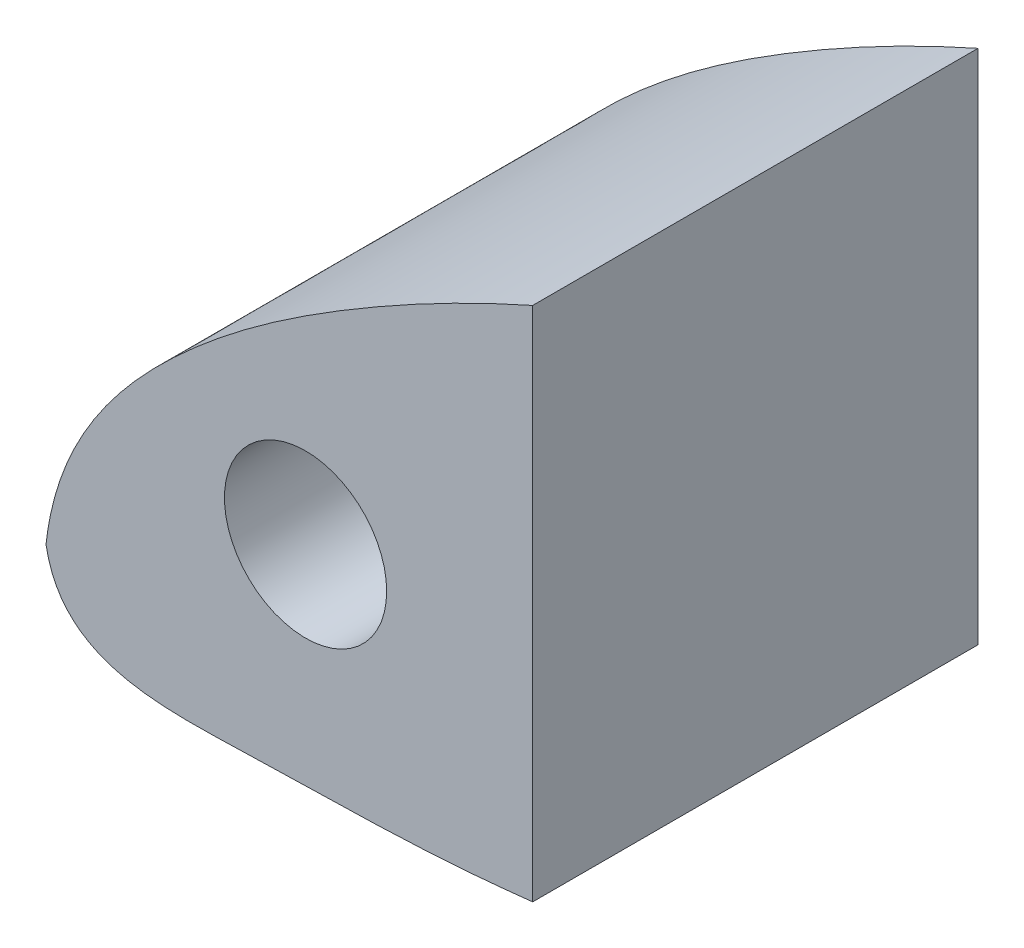
ISO-10303-21;
HEADER;
FILE_DESCRIPTION(('STEP AP214'),'2;1');
FILE_NAME('part.step','',(''),(''),'','','');
FILE_SCHEMA(('AUTOMOTIVE_DESIGN { 1 0 10303 214 1 1 1 1 }'));
ENDSEC;
DATA;
#1=APPLICATION_CONTEXT('core data for automotive mechanical design processes');
#2=APPLICATION_PROTOCOL_DEFINITION('international standard','automotive_design',2000,#1);
#3=PRODUCT_CONTEXT('',#1,'mechanical');
#4=PRODUCT('Part','Part','',(#3));
#5=PRODUCT_RELATED_PRODUCT_CATEGORY('part','',(#4));
#6=PRODUCT_DEFINITION_FORMATION('','',#4);
#7=PRODUCT_DEFINITION_CONTEXT('part definition',#1,'design');
#8=PRODUCT_DEFINITION('design','',#6,#7);
#9=PRODUCT_DEFINITION_SHAPE('','',#8);
#10=(LENGTH_UNIT() NAMED_UNIT(*) SI_UNIT(.MILLI.,.METRE.));
#11=(NAMED_UNIT(*) PLANE_ANGLE_UNIT() SI_UNIT($,.RADIAN.));
#12=(NAMED_UNIT(*) SI_UNIT($,.STERADIAN.) SOLID_ANGLE_UNIT());
#13=UNCERTAINTY_MEASURE_WITH_UNIT(LENGTH_MEASURE(1.E-05),#10,'distance_accuracy_value','');
#14=(GEOMETRIC_REPRESENTATION_CONTEXT(3) GLOBAL_UNCERTAINTY_ASSIGNED_CONTEXT((#13)) GLOBAL_UNIT_ASSIGNED_CONTEXT((#10,
#11,#12)) REPRESENTATION_CONTEXT('',''));
#15=CARTESIAN_POINT('',(0.,0.,0.));
#16=DIRECTION('',(0.,0.,1.));
#17=DIRECTION('',(1.,0.,0.));
#18=AXIS2_PLACEMENT_3D('',#15,#16,#17);
#19=CARTESIAN_POINT('',(0.000560351162113587,0.000130087070423624,34.8615));
#20=CARTESIAN_POINT('',(1.23071418869678,-6.92407609127206,34.8615));
#21=CARTESIAN_POINT('',(15.3166033306834,-6.18906584099094,34.8615));
#22=CARTESIAN_POINT('',(36.4546728163185,-6.09849990105009,34.8615));
#23=CARTESIAN_POINT('',(66.5061971849192,-0.586669106973501,34.8615));
#24=CARTESIAN_POINT('',(110.497331171581,6.18149522271792,34.8615));
#25=CARTESIAN_POINT('',(157.718638091679,9.03065014873911,34.8615));
#26=CARTESIAN_POINT('',(205.10142463584,8.83808028186313,34.8615));
#27=CARTESIAN_POINT('',(235.858814759408,7.87030619247826,34.8615));
#28=CARTESIAN_POINT('',(260.846344817159,5.42741339404395,34.8615));
#29=CARTESIAN_POINT('',(276.264022989737,4.51435670375389,34.8615));
#30=CARTESIAN_POINT('',(293.989507544058,2.09398731346533,34.8615));
#31=CARTESIAN_POINT('',(303.956832564589,1.47095520994628,34.8615));
#32=CARTESIAN_POINT('',(309.846313894505,0.000130087070423666,34.8615));
#33=B_SPLINE_CURVE_WITH_KNOTS('',3,(#19,#20,#21,#22,#23,#24,#25,#26,#27,#28,#29,#30,#31,#32),
.UNSPECIFIED.,.F.,.F.,(4,1,1,1,1,1,1,1,1,1,1,4),(0.,0.0569078595717698,0.106482711504673,
0.214488052979465,0.341297688349143,0.535095665520157,0.664680853556909,0.794660698192775,
0.828978881532905,0.904725108725214,0.942212919019968,1.),.UNSPECIFIED.);
#34=DIRECTION('',(0.,0.,-1.));
#35=VECTOR('',#34,1.);
#36=SURFACE_OF_LINEAR_EXTRUSION('',#33,#35);
#37=CARTESIAN_POINT('',(0.000560351162113587,0.000130087070423624,0.));
#38=CARTESIAN_POINT('',(1.23071418869678,-6.92407609127206,0.));
#39=CARTESIAN_POINT('',(15.3166033306834,-6.18906584099094,0.));
#40=CARTESIAN_POINT('',(36.4546728163185,-6.09849990105009,0.));
#41=CARTESIAN_POINT('',(66.5061971849192,-0.586669106973501,0.));
#42=CARTESIAN_POINT('',(110.497331171581,6.18149522271792,0.));
#43=CARTESIAN_POINT('',(157.718638091679,9.03065014873911,0.));
#44=CARTESIAN_POINT('',(205.10142463584,8.83808028186313,0.));
#45=CARTESIAN_POINT('',(235.858814759408,7.87030619247826,0.));
#46=CARTESIAN_POINT('',(260.846344817159,5.42741339404395,0.));
#47=CARTESIAN_POINT('',(276.264022989737,4.51435670375389,0.));
#48=CARTESIAN_POINT('',(293.989507544058,2.09398731346533,0.));
#49=CARTESIAN_POINT('',(303.956832564589,1.47095520994628,0.));
#50=CARTESIAN_POINT('',(309.846313894505,0.000130087070423666,0.));
#51=B_SPLINE_CURVE_WITH_KNOTS('',3,(#37,#38,#39,#40,#41,#42,#43,#44,#45,#46,#47,#48,#49,#50),
.UNSPECIFIED.,.F.,.F.,(4,1,1,1,1,1,1,1,1,1,1,4),(0.,0.0569078595717698,0.106482711504673,
0.214488052979465,0.341297688349143,0.535095665520157,0.664680853556909,0.794660698192775,
0.828978881532905,0.904725108725214,0.942212919019968,1.),.UNSPECIFIED.);
#52=CARTESIAN_POINT('',(0.000560351162116727,0.000130087070423829,0.));
#53=VERTEX_POINT('',#52);
#54=CARTESIAN_POINT('',(38.0999999979874,-5.18097252426853,0.));
#55=VERTEX_POINT('',#54);
#56=EDGE_CURVE('E100',#53,#55,#51,.T.);
#57=ORIENTED_EDGE('',*,*,#56,.T.);
#58=DIRECTION('',(0.,0.,-1.));
#59=VECTOR('',#58,1.);
#60=CARTESIAN_POINT('',(38.1,-5.18097252404465,34.8615));
#61=LINE('',#60,#59);
#62=CARTESIAN_POINT('',(38.1,-5.18097252426854,34.8615));
#63=VERTEX_POINT('',#62);
#64=EDGE_CURVE('E55',#55,#63,#61,.F.);
#65=ORIENTED_EDGE('',*,*,#64,.T.);
#66=CARTESIAN_POINT('',(0.000560351162116727,0.000130087070423829,34.8615));
#67=VERTEX_POINT('',#66);
#68=EDGE_CURVE('E84',#67,#63,#33,.T.);
#69=ORIENTED_EDGE('',*,*,#68,.F.);
#70=DIRECTION('',(0.,0.,-1.));
#71=VECTOR('',#70,1.);
#72=CARTESIAN_POINT('',(0.000560351162116727,0.000130087070423829,34.8615));
#73=LINE('',#72,#71);
#74=EDGE_CURVE('E11',#67,#53,#73,.T.);
#75=ORIENTED_EDGE('',*,*,#74,.T.);
#76=EDGE_LOOP('',(#57,#65,#69,#75));
#77=FACE_BOUND('',#76,.T.);
#78=ADVANCED_FACE('F39',(#77),#36,.F.);
#79=CARTESIAN_POINT('',(309.846313894505,0.000130087070423864,34.8615));
#80=CARTESIAN_POINT('',(314.816918223261,-0.51620674157964,34.8615));
#81=CARTESIAN_POINT('',(301.273197720551,4.38282813873556,34.8615));
#82=CARTESIAN_POINT('',(290.359837670022,8.71099439045776,34.8615));
#83=CARTESIAN_POINT('',(256.952064400645,19.5289209482833,34.8615));
#84=CARTESIAN_POINT('',(217.961060472083,29.6129748944238,34.8615));
#85=CARTESIAN_POINT('',(173.256699242147,40.0411042779434,34.8615));
#86=CARTESIAN_POINT('',(131.400792108858,47.8848319151037,34.8615));
#87=CARTESIAN_POINT('',(89.5976184754884,49.290763053775,34.8615));
#88=CARTESIAN_POINT('',(52.1111282710831,42.0692152748914,34.8615));
#89=CARTESIAN_POINT('',(26.2867198183782,29.9751763284633,34.8615));
#90=CARTESIAN_POINT('',(8.64909202481883,17.8566051741579,34.8615));
#91=CARTESIAN_POINT('',(0.810633126632263,7.35919605469637,34.8615));
#92=CARTESIAN_POINT('',(0.000560351162116727,0.000130087070423829,34.8615));
#93=B_SPLINE_CURVE_WITH_KNOTS('',3,(#79,#80,#81,#82,#83,#84,#85,#86,#87,#88,#89,#90,#91,#92),
.UNSPECIFIED.,.F.,.F.,(4,1,1,1,1,1,1,1,1,1,1,4),(0.,0.0239417713693992,0.070244030177139,
0.147561721425381,0.308455887006792,0.442387865106874,0.551517565626309,0.687091076796298,
0.811391258419108,0.886311735305172,0.939136382225768,1.),.UNSPECIFIED.);
#94=DIRECTION('',(0.,0.,-1.));
#95=VECTOR('',#94,1.);
#96=SURFACE_OF_LINEAR_EXTRUSION('',#93,#95);
#97=CARTESIAN_POINT('',(38.1,35.2581330206231,34.8615));
#98=VERTEX_POINT('',#97);
#99=EDGE_CURVE('E48',#98,#67,#93,.T.);
#100=ORIENTED_EDGE('',*,*,#99,.F.);
#101=DIRECTION('',(0.,0.,-1.));
#102=VECTOR('',#101,1.);
#103=CARTESIAN_POINT('',(38.1,35.2581330224171,34.8615));
#104=LINE('',#103,#102);
#105=CARTESIAN_POINT('',(38.1,35.2581330206231,0.));
#106=VERTEX_POINT('',#105);
#107=EDGE_CURVE('E74',#98,#106,#104,.T.);
#108=ORIENTED_EDGE('',*,*,#107,.T.);
#109=CARTESIAN_POINT('',(309.846313894505,0.000130087070423864,0.));
#110=CARTESIAN_POINT('',(314.816918223261,-0.51620674157964,0.));
#111=CARTESIAN_POINT('',(301.273197720551,4.38282813873556,0.));
#112=CARTESIAN_POINT('',(290.359837670022,8.71099439045776,0.));
#113=CARTESIAN_POINT('',(256.952064400645,19.5289209482833,0.));
#114=CARTESIAN_POINT('',(217.961060472083,29.6129748944238,0.));
#115=CARTESIAN_POINT('',(173.256699242147,40.0411042779434,0.));
#116=CARTESIAN_POINT('',(131.400792108858,47.8848319151037,0.));
#117=CARTESIAN_POINT('',(89.5976184754884,49.290763053775,0.));
#118=CARTESIAN_POINT('',(52.1111282710831,42.0692152748914,0.));
#119=CARTESIAN_POINT('',(26.2867198183782,29.9751763284633,0.));
#120=CARTESIAN_POINT('',(8.64909202481883,17.8566051741579,0.));
#121=CARTESIAN_POINT('',(0.810633126632263,7.35919605469637,0.));
#122=CARTESIAN_POINT('',(0.000560351162116727,0.000130087070423829,0.));
#123=B_SPLINE_CURVE_WITH_KNOTS('',3,(#109,#110,#111,#112,#113,#114,#115,#116,#117,#118,#119,
#120,#121,#122),.UNSPECIFIED.,.F.,.F.,(4,1,1,1,1,1,1,1,1,1,1,4),(0.,0.0239417713693992,
0.070244030177139,0.147561721425381,0.308455887006792,0.442387865106874,0.551517565626309,
0.687091076796298,0.811391258419108,0.886311735305172,0.939136382225768,1.),.UNSPECIFIED.);
#124=EDGE_CURVE('E91',#106,#53,#123,.T.);
#125=ORIENTED_EDGE('',*,*,#124,.T.);
#126=ORIENTED_EDGE('',*,*,#74,.F.);
#127=EDGE_LOOP('',(#100,#108,#125,#126));
#128=FACE_BOUND('',#127,.T.);
#129=ADVANCED_FACE('F87',(#128),#96,.F.);
#130=CARTESIAN_POINT('',(153.387816973495,8.33338198857885,34.8615));
#131=DIRECTION('',(0.,0.,-1.));
#132=DIRECTION('',(-1.,0.,0.));
#133=AXIS2_PLACEMENT_3D('',#130,#131,#132);
#134=PLANE('',#133);
#135=CARTESIAN_POINT('',(20.32,10.16,34.8615));
#136=DIRECTION('',(0.,0.,1.));
#137=DIRECTION('',(1.,0.,0.));
#138=AXIS2_PLACEMENT_3D('',#135,#136,#137);
#139=CIRCLE('',#138,6.35);
#140=CARTESIAN_POINT('',(26.67,10.16,34.8615));
#141=VERTEX_POINT('',#140);
#142=EDGE_CURVE('E133',#141,#141,#139,.T.);
#143=ORIENTED_EDGE('',*,*,#142,.F.);
#144=EDGE_LOOP('',(#143));
#145=FACE_BOUND('',#144,.T.);
#146=ORIENTED_EDGE('',*,*,#68,.T.);
#147=DIRECTION('',(0.,-1.,0.));
#148=VECTOR('',#147,1.);
#149=CARTESIAN_POINT('',(38.1,71.7179988353335,34.8615));
#150=LINE('',#149,#148);
#151=EDGE_CURVE('E76',#98,#63,#150,.T.);
#152=ORIENTED_EDGE('',*,*,#151,.F.);
#153=ORIENTED_EDGE('',*,*,#99,.T.);
#154=EDGE_LOOP('',(#146,#152,#153));
#155=FACE_BOUND('',#154,.T.);
#156=ADVANCED_FACE('F82',(#145,#155),#134,.F.);
#157=CARTESIAN_POINT('',(153.387816973495,8.33338198857885,0.));
#158=DIRECTION('',(0.,0.,-1.));
#159=DIRECTION('',(-1.,0.,0.));
#160=AXIS2_PLACEMENT_3D('',#157,#158,#159);
#161=PLANE('',#160);
#162=DIRECTION('',(0.,-1.,0.));
#163=VECTOR('',#162,1.);
#164=CARTESIAN_POINT('',(38.1,71.7179988353335,0.));
#165=LINE('',#164,#163);
#166=EDGE_CURVE('E77',#106,#55,#165,.T.);
#167=ORIENTED_EDGE('',*,*,#166,.T.);
#168=ORIENTED_EDGE('',*,*,#56,.F.);
#169=ORIENTED_EDGE('',*,*,#124,.F.);
#170=EDGE_LOOP('',(#167,#168,#169));
#171=FACE_BOUND('',#170,.T.);
#172=CARTESIAN_POINT('',(20.32,10.16,0.));
#173=DIRECTION('',(0.,0.,1.));
#174=DIRECTION('',(1.,0.,0.));
#175=AXIS2_PLACEMENT_3D('',#172,#173,#174);
#176=CIRCLE('',#175,6.35);
#177=CARTESIAN_POINT('',(26.67,10.16,0.));
#178=VERTEX_POINT('',#177);
#179=EDGE_CURVE('E129',#178,#178,#176,.T.);
#180=ORIENTED_EDGE('',*,*,#179,.T.);
#181=EDGE_LOOP('',(#180));
#182=FACE_BOUND('',#181,.T.);
#183=ADVANCED_FACE('F108',(#171,#182),#161,.T.);
#184=CARTESIAN_POINT('',(20.32,10.16,0.));
#185=DIRECTION('',(0.,0.,1.));
#186=DIRECTION('',(1.,0.,0.));
#187=AXIS2_PLACEMENT_3D('',#184,#185,#186);
#188=CYLINDRICAL_SURFACE('',#187,6.35);
#189=ORIENTED_EDGE('',*,*,#179,.F.);
#190=EDGE_LOOP('',(#189));
#191=FACE_BOUND('',#190,.T.);
#192=ORIENTED_EDGE('',*,*,#142,.T.);
#193=EDGE_LOOP('',(#192));
#194=FACE_BOUND('',#193,.T.);
#195=ADVANCED_FACE('F111',(#191,#194),#188,.F.);
#196=CARTESIAN_POINT('',(38.1,71.7179988353335,0.));
#197=DIRECTION('',(-1.,0.,0.));
#198=DIRECTION('',(0.,-1.,0.));
#199=AXIS2_PLACEMENT_3D('',#196,#197,#198);
#200=PLANE('',#199);
#201=ORIENTED_EDGE('',*,*,#166,.F.);
#202=ORIENTED_EDGE('',*,*,#107,.F.);
#203=ORIENTED_EDGE('',*,*,#151,.T.);
#204=ORIENTED_EDGE('',*,*,#64,.F.);
#205=EDGE_LOOP('',(#201,#202,#203,#204));
#206=FACE_BOUND('',#205,.T.);
#207=ADVANCED_FACE('F75',(#206),#200,.F.);
#208=CLOSED_SHELL('',(#78,#129,#156,#183,#195,#207));
#209=MANIFOLD_SOLID_BREP('B2',#208);
#210=ADVANCED_BREP_SHAPE_REPRESENTATION('',(#18,#209),#14);
#211=SHAPE_DEFINITION_REPRESENTATION(#9,#210);
ENDSEC;
END-ISO-10303-21;
